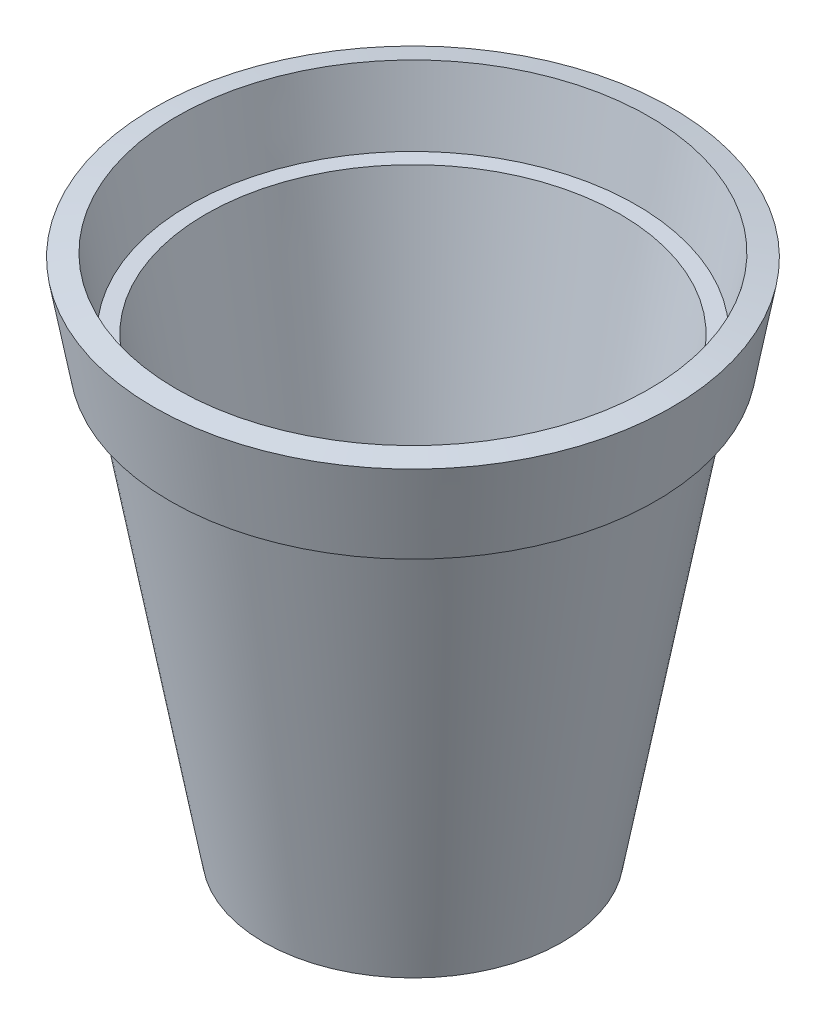
ISO-10303-21;
HEADER;
FILE_DESCRIPTION(('STEP AP214'),'2;1');
FILE_NAME('part.step','',(''),(''),'','','');
FILE_SCHEMA(('AUTOMOTIVE_DESIGN { 1 0 10303 214 1 1 1 1 }'));
ENDSEC;
DATA;
#1=APPLICATION_CONTEXT('core data for automotive mechanical design processes');
#2=APPLICATION_PROTOCOL_DEFINITION('international standard','automotive_design',2000,#1);
#3=PRODUCT_CONTEXT('',#1,'mechanical');
#4=PRODUCT('Part','Part','',(#3));
#5=PRODUCT_RELATED_PRODUCT_CATEGORY('part','',(#4));
#6=PRODUCT_DEFINITION_FORMATION('','',#4);
#7=PRODUCT_DEFINITION_CONTEXT('part definition',#1,'design');
#8=PRODUCT_DEFINITION('design','',#6,#7);
#9=PRODUCT_DEFINITION_SHAPE('','',#8);
#10=(LENGTH_UNIT() NAMED_UNIT(*) SI_UNIT(.MILLI.,.METRE.));
#11=(NAMED_UNIT(*) PLANE_ANGLE_UNIT() SI_UNIT($,.RADIAN.));
#12=(NAMED_UNIT(*) SI_UNIT($,.STERADIAN.) SOLID_ANGLE_UNIT());
#13=UNCERTAINTY_MEASURE_WITH_UNIT(LENGTH_MEASURE(1.E-05),#10,'distance_accuracy_value','');
#14=(GEOMETRIC_REPRESENTATION_CONTEXT(3) GLOBAL_UNCERTAINTY_ASSIGNED_CONTEXT((#13)) GLOBAL_UNIT_ASSIGNED_CONTEXT((#10,
#11,#12)) REPRESENTATION_CONTEXT('',''));
#15=CARTESIAN_POINT('',(0.,0.,0.));
#16=DIRECTION('',(0.,0.,1.));
#17=DIRECTION('',(1.,0.,0.));
#18=AXIS2_PLACEMENT_3D('',#15,#16,#17);
#19=CARTESIAN_POINT('',(0.,0.,0.));
#20=DIRECTION('',(0.,1.,0.));
#21=DIRECTION('',(0.,0.,1.));
#22=AXIS2_PLACEMENT_3D('',#19,#20,#21);
#23=PLANE('',#22);
#24=CARTESIAN_POINT('',(0.,0.,0.));
#25=DIRECTION('',(0.,1.,0.));
#26=DIRECTION('',(0.,0.,1.));
#27=AXIS2_PLACEMENT_3D('',#24,#25,#26);
#28=CIRCLE('',#27,46.);
#29=CARTESIAN_POINT('',(0.,0.,46.));
#30=VERTEX_POINT('',#29);
#31=EDGE_CURVE('E10',#30,#30,#28,.T.);
#32=ORIENTED_EDGE('',*,*,#31,.F.);
#33=EDGE_LOOP('',(#32));
#34=FACE_BOUND('',#33,.T.);
#35=ADVANCED_FACE('F36',(#34),#23,.F.);
#36=CARTESIAN_POINT('',(0.,0.,0.));
#37=DIRECTION('',(0.,1.,0.));
#38=DIRECTION('',(0.,0.,1.));
#39=AXIS2_PLACEMENT_3D('',#36,#37,#38);
#40=CONICAL_SURFACE('',#39,46.,0.179215744776902);
#41=CARTESIAN_POINT('',(0.,132.48,0.));
#42=DIRECTION('',(0.,1.,0.));
#43=DIRECTION('',(0.,0.,1.));
#44=AXIS2_PLACEMENT_3D('',#41,#42,#43);
#45=CIRCLE('',#44,70.);
#46=CARTESIAN_POINT('',(0.,132.48,70.));
#47=VERTEX_POINT('',#46);
#48=EDGE_CURVE('E43',#47,#47,#45,.T.);
#49=ORIENTED_EDGE('',*,*,#48,.F.);
#50=EDGE_LOOP('',(#49));
#51=FACE_BOUND('',#50,.T.);
#52=ORIENTED_EDGE('',*,*,#31,.T.);
#53=EDGE_LOOP('',(#52));
#54=FACE_BOUND('',#53,.T.);
#55=ADVANCED_FACE('F110',(#51,#54),#40,.T.);
#56=CARTESIAN_POINT('',(70.,132.48,0.));
#57=DIRECTION('',(0.,1.,0.));
#58=DIRECTION('',(0.,0.,1.));
#59=AXIS2_PLACEMENT_3D('',#56,#57,#58);
#60=PLANE('',#59);
#61=CARTESIAN_POINT('',(0.,132.48,0.));
#62=DIRECTION('',(0.,1.,0.));
#63=DIRECTION('',(0.,0.,1.));
#64=AXIS2_PLACEMENT_3D('',#61,#62,#63);
#65=CIRCLE('',#64,75.);
#66=CARTESIAN_POINT('',(0.,132.48,75.));
#67=VERTEX_POINT('',#66);
#68=EDGE_CURVE('E49',#67,#67,#65,.T.);
#69=ORIENTED_EDGE('',*,*,#68,.F.);
#70=EDGE_LOOP('',(#69));
#71=FACE_BOUND('',#70,.T.);
#72=ORIENTED_EDGE('',*,*,#48,.T.);
#73=EDGE_LOOP('',(#72));
#74=FACE_BOUND('',#73,.T.);
#75=ADVANCED_FACE('F105',(#71,#74),#60,.F.);
#76=CARTESIAN_POINT('',(0.,132.48,0.));
#77=DIRECTION('',(0.,1.,0.));
#78=DIRECTION('',(0.,0.,1.));
#79=AXIS2_PLACEMENT_3D('',#76,#77,#78);
#80=CONICAL_SURFACE('',#79,75.,0.179215744776902);
#81=CARTESIAN_POINT('',(0.,160.08,0.));
#82=DIRECTION('',(0.,1.,0.));
#83=DIRECTION('',(0.,0.,1.));
#84=AXIS2_PLACEMENT_3D('',#81,#82,#83);
#85=CIRCLE('',#84,80.);
#86=CARTESIAN_POINT('',(0.,160.08,80.));
#87=VERTEX_POINT('',#86);
#88=EDGE_CURVE('E55',#87,#87,#85,.T.);
#89=ORIENTED_EDGE('',*,*,#88,.F.);
#90=EDGE_LOOP('',(#89));
#91=FACE_BOUND('',#90,.T.);
#92=ORIENTED_EDGE('',*,*,#68,.T.);
#93=EDGE_LOOP('',(#92));
#94=FACE_BOUND('',#93,.T.);
#95=ADVANCED_FACE('F99',(#91,#94),#80,.T.);
#96=CARTESIAN_POINT('',(0.,160.08,0.));
#97=DIRECTION('',(0.,-1.,0.));
#98=DIRECTION('',(0.,0.,-1.));
#99=AXIS2_PLACEMENT_3D('',#96,#97,#98);
#100=CONICAL_SURFACE('',#99,80.,1.391580582018);
#101=CARTESIAN_POINT('',(0.,161.363457124034,0.));
#102=DIRECTION('',(0.,1.,0.));
#103=DIRECTION('',(0.,0.,1.));
#104=AXIS2_PLACEMENT_3D('',#101,#102,#103);
#105=CIRCLE('',#104,72.9153166753363);
#106=CARTESIAN_POINT('',(0.,161.363457124034,72.9153166753363));
#107=VERTEX_POINT('',#106);
#108=EDGE_CURVE('E61',#107,#107,#105,.T.);
#109=ORIENTED_EDGE('',*,*,#108,.F.);
#110=EDGE_LOOP('',(#109));
#111=FACE_BOUND('',#110,.T.);
#112=ORIENTED_EDGE('',*,*,#88,.T.);
#113=EDGE_LOOP('',(#112));
#114=FACE_BOUND('',#113,.T.);
#115=ADVANCED_FACE('F93',(#111,#114),#100,.T.);
#116=CARTESIAN_POINT('',(0.,161.363457124034,0.));
#117=DIRECTION('',(0.,1.,0.));
#118=DIRECTION('',(0.,0.,1.));
#119=AXIS2_PLACEMENT_3D('',#116,#117,#118);
#120=CONICAL_SURFACE('',#119,72.9153166753363,0.179215744776902);
#121=CARTESIAN_POINT('',(0.,139.68,0.));
#122=DIRECTION('',(0.,1.,0.));
#123=DIRECTION('',(0.,0.,1.));
#124=AXIS2_PLACEMENT_3D('',#121,#122,#123);
#125=CIRCLE('',#124,68.9871541528665);
#126=CARTESIAN_POINT('',(0.,139.68,68.9871541528665));
#127=VERTEX_POINT('',#126);
#128=EDGE_CURVE('E65',#127,#127,#125,.T.);
#129=ORIENTED_EDGE('',*,*,#128,.F.);
#130=EDGE_LOOP('',(#129));
#131=FACE_BOUND('',#130,.T.);
#132=ORIENTED_EDGE('',*,*,#108,.T.);
#133=EDGE_LOOP('',(#132));
#134=FACE_BOUND('',#133,.T.);
#135=ADVANCED_FACE('F87',(#131,#134),#120,.F.);
#136=CARTESIAN_POINT('',(63.9871541528665,139.68,0.));
#137=DIRECTION('',(0.,-1.,0.));
#138=DIRECTION('',(0.,0.,-1.));
#139=AXIS2_PLACEMENT_3D('',#136,#137,#138);
#140=PLANE('',#139);
#141=CARTESIAN_POINT('',(0.,139.68,0.));
#142=DIRECTION('',(0.,1.,0.));
#143=DIRECTION('',(0.,0.,1.));
#144=AXIS2_PLACEMENT_3D('',#141,#142,#143);
#145=CIRCLE('',#144,63.9871541528665);
#146=CARTESIAN_POINT('',(0.,139.68,63.9871541528665));
#147=VERTEX_POINT('',#146);
#148=EDGE_CURVE('E69',#147,#147,#145,.T.);
#149=ORIENTED_EDGE('',*,*,#148,.F.);
#150=EDGE_LOOP('',(#149));
#151=FACE_BOUND('',#150,.T.);
#152=ORIENTED_EDGE('',*,*,#128,.T.);
#153=EDGE_LOOP('',(#152));
#154=FACE_BOUND('',#153,.T.);
#155=ADVANCED_FACE('F81',(#151,#154),#140,.F.);
#156=CARTESIAN_POINT('',(0.,139.68,0.));
#157=DIRECTION('',(0.,1.,0.));
#158=DIRECTION('',(0.,0.,1.));
#159=AXIS2_PLACEMENT_3D('',#156,#157,#158);
#160=CONICAL_SURFACE('',#159,63.9871541528665,0.179215744776902);
#161=CARTESIAN_POINT('',(0.,7.2,0.));
#162=DIRECTION('',(0.,1.,0.));
#163=DIRECTION('',(0.,0.,1.));
#164=AXIS2_PLACEMENT_3D('',#161,#162,#163);
#165=CIRCLE('',#164,39.9871541528665);
#166=CARTESIAN_POINT('',(0.,7.2,39.9871541528665));
#167=VERTEX_POINT('',#166);
#168=EDGE_CURVE('E72',#167,#167,#165,.T.);
#169=ORIENTED_EDGE('',*,*,#168,.F.);
#170=EDGE_LOOP('',(#169));
#171=FACE_BOUND('',#170,.T.);
#172=ORIENTED_EDGE('',*,*,#148,.T.);
#173=EDGE_LOOP('',(#172));
#174=FACE_BOUND('',#173,.T.);
#175=ADVANCED_FACE('F78',(#171,#174),#160,.F.);
#176=CARTESIAN_POINT('',(0.,7.2,0.));
#177=DIRECTION('',(0.,-1.,0.));
#178=DIRECTION('',(0.,0.,-1.));
#179=AXIS2_PLACEMENT_3D('',#176,#177,#178);
#180=PLANE('',#179);
#181=ORIENTED_EDGE('',*,*,#168,.T.);
#182=EDGE_LOOP('',(#181));
#183=FACE_BOUND('',#182,.T.);
#184=ADVANCED_FACE('F76',(#183),#180,.F.);
#185=CLOSED_SHELL('',(#35,#55,#75,#95,#115,#135,#155,#175,#184));
#186=MANIFOLD_SOLID_BREP('B2',#185);
#187=ADVANCED_BREP_SHAPE_REPRESENTATION('',(#18,#186),#14);
#188=SHAPE_DEFINITION_REPRESENTATION(#9,#187);
ENDSEC;
END-ISO-10303-21;
